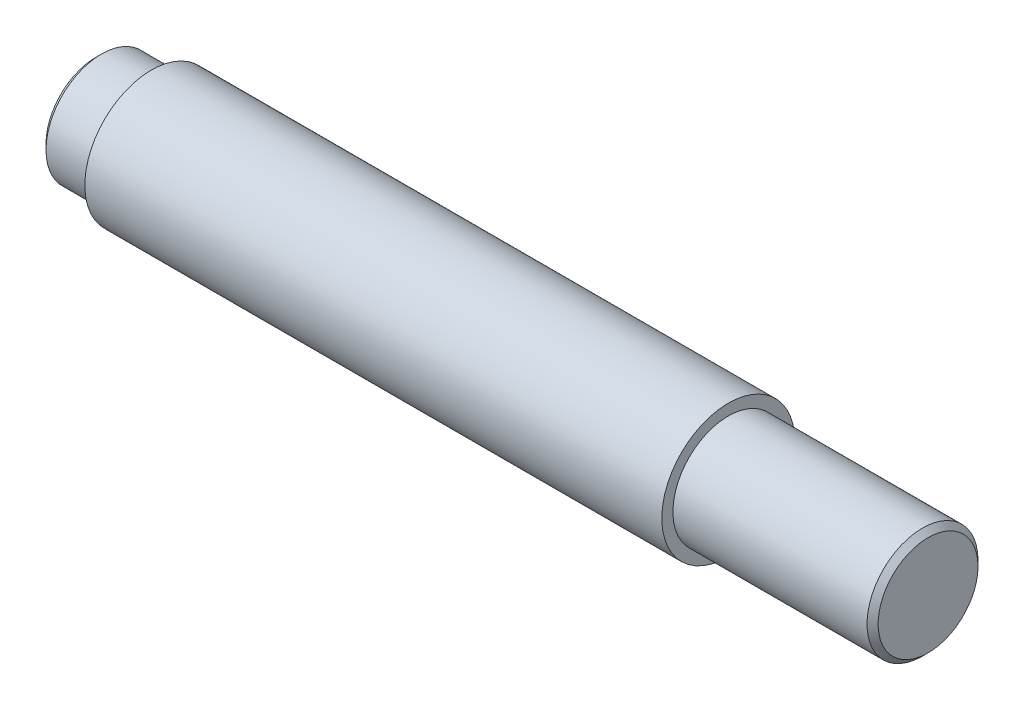
ISO-10303-21;
HEADER;
FILE_DESCRIPTION(('STEP AP214'),'2;1');
FILE_NAME('part.step','',(''),(''),'','','');
FILE_SCHEMA(('AUTOMOTIVE_DESIGN { 1 0 10303 214 1 1 1 1 }'));
ENDSEC;
DATA;
#1=APPLICATION_CONTEXT('core data for automotive mechanical design processes');
#2=APPLICATION_PROTOCOL_DEFINITION('international standard','automotive_design',2000,#1);
#3=PRODUCT_CONTEXT('',#1,'mechanical');
#4=PRODUCT('Part','Part','',(#3));
#5=PRODUCT_RELATED_PRODUCT_CATEGORY('part','',(#4));
#6=PRODUCT_DEFINITION_FORMATION('','',#4);
#7=PRODUCT_DEFINITION_CONTEXT('part definition',#1,'design');
#8=PRODUCT_DEFINITION('design','',#6,#7);
#9=PRODUCT_DEFINITION_SHAPE('','',#8);
#10=(LENGTH_UNIT() NAMED_UNIT(*) SI_UNIT(.MILLI.,.METRE.));
#11=(NAMED_UNIT(*) PLANE_ANGLE_UNIT() SI_UNIT($,.RADIAN.));
#12=(NAMED_UNIT(*) SI_UNIT($,.STERADIAN.) SOLID_ANGLE_UNIT());
#13=UNCERTAINTY_MEASURE_WITH_UNIT(LENGTH_MEASURE(1.E-05),#10,'distance_accuracy_value','');
#14=(GEOMETRIC_REPRESENTATION_CONTEXT(3) GLOBAL_UNCERTAINTY_ASSIGNED_CONTEXT((#13)) GLOBAL_UNIT_ASSIGNED_CONTEXT((#10,
#11,#12)) REPRESENTATION_CONTEXT('',''));
#15=CARTESIAN_POINT('',(0.,0.,0.));
#16=DIRECTION('',(0.,0.,1.));
#17=DIRECTION('',(1.,0.,0.));
#18=AXIS2_PLACEMENT_3D('',#15,#16,#17);
#19=CARTESIAN_POINT('',(-8.63036303630363,0.,0.));
#20=DIRECTION('',(-1.,0.,0.));
#21=DIRECTION('',(0.,0.,1.));
#22=AXIS2_PLACEMENT_3D('',#19,#20,#21);
#23=PLANE('',#22);
#24=CARTESIAN_POINT('',(-8.63036303630363,0.,0.));
#25=DIRECTION('',(-1.,0.,0.));
#26=DIRECTION('',(0.,0.,1.));
#27=AXIS2_PLACEMENT_3D('',#24,#25,#26);
#28=CIRCLE('',#27,4.5);
#29=CARTESIAN_POINT('',(-8.63036303630363,0.,4.5));
#30=VERTEX_POINT('',#29);
#31=EDGE_CURVE('E49',#30,#30,#28,.T.);
#32=ORIENTED_EDGE('',*,*,#31,.T.);
#33=EDGE_LOOP('',(#32));
#34=FACE_BOUND('',#33,.T.);
#35=ADVANCED_FACE('F37',(#34),#23,.T.);
#36=CARTESIAN_POINT('',(66.3696369636964,0.,0.));
#37=DIRECTION('',(1.,0.,0.));
#38=DIRECTION('',(0.,0.,-1.));
#39=AXIS2_PLACEMENT_3D('',#36,#37,#38);
#40=CYLINDRICAL_SURFACE('',#39,5.);
#41=CARTESIAN_POINT('',(-8.13036303630363,0.,0.));
#42=DIRECTION('',(-1.,0.,0.));
#43=DIRECTION('',(0.,0.,1.));
#44=AXIS2_PLACEMENT_3D('',#41,#42,#43);
#45=CIRCLE('',#44,5.);
#46=CARTESIAN_POINT('',(-8.13036303630363,0.,5.));
#47=VERTEX_POINT('',#46);
#48=EDGE_CURVE('E53',#47,#47,#45,.F.);
#49=ORIENTED_EDGE('',*,*,#48,.T.);
#50=EDGE_LOOP('',(#49));
#51=FACE_BOUND('',#50,.T.);
#52=CARTESIAN_POINT('',(-3.63036303630362,0.,0.));
#53=DIRECTION('',(1.,0.,0.));
#54=DIRECTION('',(0.,0.,-1.));
#55=AXIS2_PLACEMENT_3D('',#52,#53,#54);
#56=CIRCLE('',#55,5.);
#57=CARTESIAN_POINT('',(-3.63036303630362,0.,-5.));
#58=VERTEX_POINT('',#57);
#59=EDGE_CURVE('E58',#58,#58,#56,.T.);
#60=ORIENTED_EDGE('',*,*,#59,.F.);
#61=EDGE_LOOP('',(#60));
#62=FACE_BOUND('',#61,.T.);
#63=ADVANCED_FACE('F88',(#51,#62),#40,.T.);
#64=CARTESIAN_POINT('',(-3.63036303630363,0.,-5.));
#65=DIRECTION('',(-1.,0.,0.));
#66=DIRECTION('',(0.,0.,1.));
#67=AXIS2_PLACEMENT_3D('',#64,#65,#66);
#68=PLANE('',#67);
#69=ORIENTED_EDGE('',*,*,#59,.T.);
#70=EDGE_LOOP('',(#69));
#71=FACE_BOUND('',#70,.T.);
#72=CARTESIAN_POINT('',(-3.63036303630362,0.,0.));
#73=DIRECTION('',(1.,0.,0.));
#74=DIRECTION('',(0.,0.,-1.));
#75=AXIS2_PLACEMENT_3D('',#72,#73,#74);
#76=CIRCLE('',#75,6.);
#77=CARTESIAN_POINT('',(-3.63036303630363,0.,-6.));
#78=VERTEX_POINT('',#77);
#79=EDGE_CURVE('E61',#78,#78,#76,.T.);
#80=ORIENTED_EDGE('',*,*,#79,.F.);
#81=EDGE_LOOP('',(#80));
#82=FACE_BOUND('',#81,.T.);
#83=ADVANCED_FACE('F84',(#71,#82),#68,.T.);
#84=CARTESIAN_POINT('',(66.3696369636964,0.,0.));
#85=DIRECTION('',(1.,0.,0.));
#86=DIRECTION('',(0.,0.,-1.));
#87=AXIS2_PLACEMENT_3D('',#84,#85,#86);
#88=CYLINDRICAL_SURFACE('',#87,6.);
#89=ORIENTED_EDGE('',*,*,#79,.T.);
#90=EDGE_LOOP('',(#89));
#91=FACE_BOUND('',#90,.T.);
#92=CARTESIAN_POINT('',(48.3696369636964,0.,0.));
#93=DIRECTION('',(1.,0.,0.));
#94=DIRECTION('',(0.,0.,-1.));
#95=AXIS2_PLACEMENT_3D('',#92,#93,#94);
#96=CIRCLE('',#95,5.99999999999999);
#97=CARTESIAN_POINT('',(48.3696369636964,0.,-6.));
#98=VERTEX_POINT('',#97);
#99=EDGE_CURVE('E64',#98,#98,#96,.T.);
#100=ORIENTED_EDGE('',*,*,#99,.F.);
#101=EDGE_LOOP('',(#100));
#102=FACE_BOUND('',#101,.T.);
#103=ADVANCED_FACE('F75',(#91,#102),#88,.T.);
#104=CARTESIAN_POINT('',(48.3696369636964,0.,-6.));
#105=DIRECTION('',(1.,0.,0.));
#106=DIRECTION('',(0.,0.,-1.));
#107=AXIS2_PLACEMENT_3D('',#104,#105,#106);
#108=PLANE('',#107);
#109=ORIENTED_EDGE('',*,*,#99,.T.);
#110=EDGE_LOOP('',(#109));
#111=FACE_BOUND('',#110,.T.);
#112=CARTESIAN_POINT('',(48.3696369636964,0.,0.));
#113=DIRECTION('',(1.,0.,0.));
#114=DIRECTION('',(0.,0.,-1.));
#115=AXIS2_PLACEMENT_3D('',#112,#113,#114);
#116=CIRCLE('',#115,4.99999999999999);
#117=CARTESIAN_POINT('',(48.3696369636964,0.,-5.));
#118=VERTEX_POINT('',#117);
#119=EDGE_CURVE('E67',#118,#118,#116,.T.);
#120=ORIENTED_EDGE('',*,*,#119,.F.);
#121=EDGE_LOOP('',(#120));
#122=FACE_BOUND('',#121,.T.);
#123=ADVANCED_FACE('F73',(#111,#122),#108,.T.);
#124=CARTESIAN_POINT('',(66.3696369636964,0.,0.));
#125=DIRECTION('',(1.,0.,0.));
#126=DIRECTION('',(0.,0.,-1.));
#127=AXIS2_PLACEMENT_3D('',#124,#125,#126);
#128=CYLINDRICAL_SURFACE('',#127,4.99999999999999);
#129=CARTESIAN_POINT('',(65.8696369636964,0.,0.));
#130=DIRECTION('',(1.,0.,0.));
#131=DIRECTION('',(0.,0.,-1.));
#132=AXIS2_PLACEMENT_3D('',#129,#130,#131);
#133=CIRCLE('',#132,4.99999999999999);
#134=CARTESIAN_POINT('',(65.8696369636964,0.,-5.));
#135=VERTEX_POINT('',#134);
#136=EDGE_CURVE('E10',#135,#135,#133,.F.);
#137=ORIENTED_EDGE('',*,*,#136,.T.);
#138=EDGE_LOOP('',(#137));
#139=FACE_BOUND('',#138,.T.);
#140=ORIENTED_EDGE('',*,*,#119,.T.);
#141=EDGE_LOOP('',(#140));
#142=FACE_BOUND('',#141,.T.);
#143=ADVANCED_FACE('F71',(#139,#142),#128,.T.);
#144=CARTESIAN_POINT('',(66.3696369636964,0.,-5.));
#145=DIRECTION('',(1.,0.,0.));
#146=DIRECTION('',(0.,0.,-1.));
#147=AXIS2_PLACEMENT_3D('',#144,#145,#146);
#148=PLANE('',#147);
#149=CARTESIAN_POINT('',(66.3696369636964,0.,0.));
#150=DIRECTION('',(1.,0.,0.));
#151=DIRECTION('',(0.,0.,-1.));
#152=AXIS2_PLACEMENT_3D('',#149,#150,#151);
#153=CIRCLE('',#152,4.5);
#154=CARTESIAN_POINT('',(66.3696369636964,0.,-4.5));
#155=VERTEX_POINT('',#154);
#156=EDGE_CURVE('E45',#155,#155,#153,.T.);
#157=ORIENTED_EDGE('',*,*,#156,.T.);
#158=EDGE_LOOP('',(#157));
#159=FACE_BOUND('',#158,.T.);
#160=ADVANCED_FACE('F82',(#159),#148,.T.);
#161=CARTESIAN_POINT('',(-8.13036303630363,0.,0.));
#162=DIRECTION('',(1.,0.,0.));
#163=DIRECTION('',(0.,0.,-1.));
#164=AXIS2_PLACEMENT_3D('',#161,#162,#163);
#165=CONICAL_SURFACE('',#164,5.,0.785398163397451);
#166=ORIENTED_EDGE('',*,*,#31,.F.);
#167=EDGE_LOOP('',(#166));
#168=FACE_BOUND('',#167,.T.);
#169=ORIENTED_EDGE('',*,*,#48,.F.);
#170=EDGE_LOOP('',(#169));
#171=FACE_BOUND('',#170,.T.);
#172=ADVANCED_FACE('F98',(#168,#171),#165,.T.);
#173=CARTESIAN_POINT('',(66.3696369636964,0.,0.));
#174=DIRECTION('',(-1.,0.,0.));
#175=DIRECTION('',(0.,0.,1.));
#176=AXIS2_PLACEMENT_3D('',#173,#174,#175);
#177=CONICAL_SURFACE('',#176,4.5,0.785398163397458);
#178=ORIENTED_EDGE('',*,*,#136,.F.);
#179=EDGE_LOOP('',(#178));
#180=FACE_BOUND('',#179,.T.);
#181=ORIENTED_EDGE('',*,*,#156,.F.);
#182=EDGE_LOOP('',(#181));
#183=FACE_BOUND('',#182,.T.);
#184=ADVANCED_FACE('F40',(#180,#183),#177,.T.);
#185=CLOSED_SHELL('',(#35,#63,#83,#103,#123,#143,#160,#172,#184));
#186=MANIFOLD_SOLID_BREP('B2',#185);
#187=ADVANCED_BREP_SHAPE_REPRESENTATION('',(#18,#186),#14);
#188=SHAPE_DEFINITION_REPRESENTATION(#9,#187);
ENDSEC;
END-ISO-10303-21;
